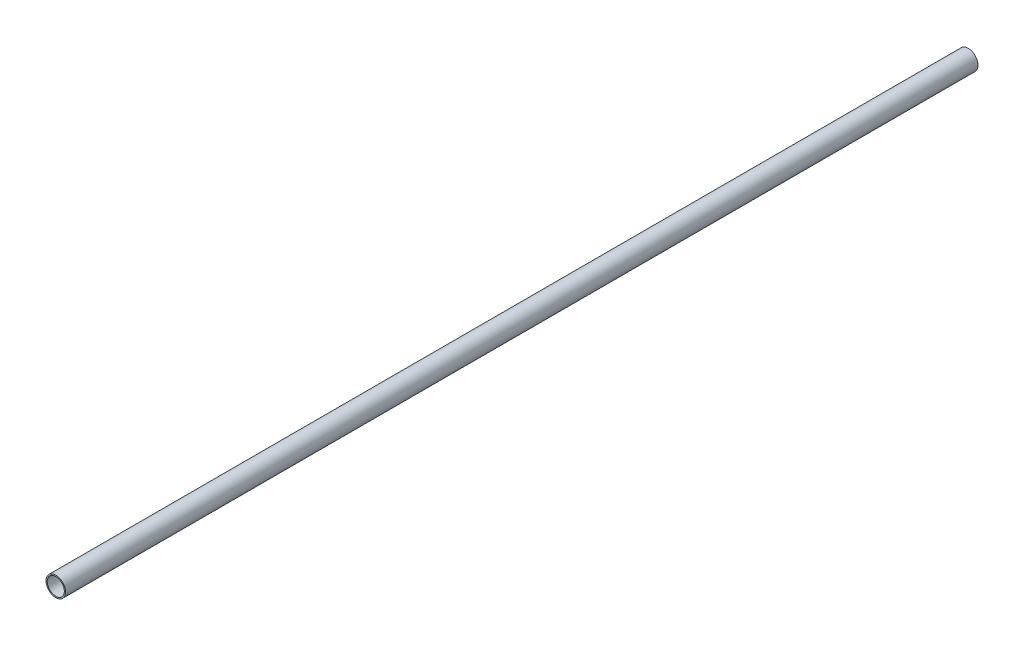
ISO-10303-21;
HEADER;
FILE_DESCRIPTION(('STEP AP214'),'2;1');
FILE_NAME('part.step','',(''),(''),'','','');
FILE_SCHEMA(('AUTOMOTIVE_DESIGN { 1 0 10303 214 1 1 1 1 }'));
ENDSEC;
DATA;
#1=APPLICATION_CONTEXT('core data for automotive mechanical design processes');
#2=APPLICATION_PROTOCOL_DEFINITION('international standard','automotive_design',2000,#1);
#3=PRODUCT_CONTEXT('',#1,'mechanical');
#4=PRODUCT('Part','Part','',(#3));
#5=PRODUCT_RELATED_PRODUCT_CATEGORY('part','',(#4));
#6=PRODUCT_DEFINITION_FORMATION('','',#4);
#7=PRODUCT_DEFINITION_CONTEXT('part definition',#1,'design');
#8=PRODUCT_DEFINITION('design','',#6,#7);
#9=PRODUCT_DEFINITION_SHAPE('','',#8);
#10=(LENGTH_UNIT() NAMED_UNIT(*) SI_UNIT(.MILLI.,.METRE.));
#11=(NAMED_UNIT(*) PLANE_ANGLE_UNIT() SI_UNIT($,.RADIAN.));
#12=(NAMED_UNIT(*) SI_UNIT($,.STERADIAN.) SOLID_ANGLE_UNIT());
#13=UNCERTAINTY_MEASURE_WITH_UNIT(LENGTH_MEASURE(1.E-05),#10,'distance_accuracy_value','');
#14=(GEOMETRIC_REPRESENTATION_CONTEXT(3) GLOBAL_UNCERTAINTY_ASSIGNED_CONTEXT((#13)) GLOBAL_UNIT_ASSIGNED_CONTEXT((#10,
#11,#12)) REPRESENTATION_CONTEXT('',''));
#15=CARTESIAN_POINT('',(0.,0.,0.));
#16=DIRECTION('',(0.,0.,1.));
#17=DIRECTION('',(1.,0.,0.));
#18=AXIS2_PLACEMENT_3D('',#15,#16,#17);
#19=CARTESIAN_POINT('',(2449.7201128805,-5187.00741573402,2250.));
#20=DIRECTION('',(0.,0.,1.));
#21=DIRECTION('',(1.,0.,0.));
#22=AXIS2_PLACEMENT_3D('',#19,#20,#21);
#23=PLANE('',#22);
#24=CARTESIAN_POINT('',(2449.7201128805,-5187.00741573402,2250.));
#25=DIRECTION('',(0.,0.,1.));
#26=DIRECTION('',(1.,0.,0.));
#27=AXIS2_PLACEMENT_3D('',#24,#25,#26);
#28=CIRCLE('',#27,24.125);
#29=CARTESIAN_POINT('',(2473.8451128805,-5187.00741573402,2250.));
#30=VERTEX_POINT('',#29);
#31=EDGE_CURVE('E10',#30,#30,#28,.T.);
#32=ORIENTED_EDGE('',*,*,#31,.T.);
#33=EDGE_LOOP('',(#32));
#34=FACE_BOUND('',#33,.T.);
#35=CARTESIAN_POINT('',(2449.7201128805,-5187.00741573402,2250.));
#36=DIRECTION('',(0.,0.,1.));
#37=DIRECTION('',(1.,0.,0.));
#38=AXIS2_PLACEMENT_3D('',#35,#36,#37);
#39=CIRCLE('',#38,21.0750000000002);
#40=CARTESIAN_POINT('',(2470.7951128805,-5187.00741573402,2250.));
#41=VERTEX_POINT('',#40);
#42=EDGE_CURVE('E43',#41,#41,#39,.T.);
#43=ORIENTED_EDGE('',*,*,#42,.F.);
#44=EDGE_LOOP('',(#43));
#45=FACE_BOUND('',#44,.T.);
#46=ADVANCED_FACE('F32',(#34,#45),#23,.T.);
#47=CARTESIAN_POINT('',(2449.7201128805,-5187.00741573402,0.));
#48=DIRECTION('',(0.,0.,1.));
#49=DIRECTION('',(1.,0.,0.));
#50=AXIS2_PLACEMENT_3D('',#47,#48,#49);
#51=PLANE('',#50);
#52=CARTESIAN_POINT('',(2449.7201128805,-5187.00741573402,0.));
#53=DIRECTION('',(0.,0.,1.));
#54=DIRECTION('',(1.,0.,0.));
#55=AXIS2_PLACEMENT_3D('',#52,#53,#54);
#56=CIRCLE('',#55,24.125);
#57=CARTESIAN_POINT('',(2473.8451128805,-5187.00741573402,0.));
#58=VERTEX_POINT('',#57);
#59=EDGE_CURVE('E36',#58,#58,#56,.T.);
#60=ORIENTED_EDGE('',*,*,#59,.F.);
#61=EDGE_LOOP('',(#60));
#62=FACE_BOUND('',#61,.T.);
#63=CARTESIAN_POINT('',(2449.7201128805,-5187.00741573402,0.));
#64=DIRECTION('',(0.,0.,1.));
#65=DIRECTION('',(1.,0.,0.));
#66=AXIS2_PLACEMENT_3D('',#63,#64,#65);
#67=CIRCLE('',#66,21.0750000000002);
#68=CARTESIAN_POINT('',(2470.7951128805,-5187.00741573402,0.));
#69=VERTEX_POINT('',#68);
#70=EDGE_CURVE('E45',#69,#69,#67,.T.);
#71=ORIENTED_EDGE('',*,*,#70,.T.);
#72=EDGE_LOOP('',(#71));
#73=FACE_BOUND('',#72,.T.);
#74=ADVANCED_FACE('F55',(#62,#73),#51,.F.);
#75=CARTESIAN_POINT('',(2449.7201128805,-5187.00741573402,2250.));
#76=DIRECTION('',(0.,0.,-1.));
#77=DIRECTION('',(-1.,0.,0.));
#78=AXIS2_PLACEMENT_3D('',#75,#76,#77);
#79=CYLINDRICAL_SURFACE('',#78,24.125);
#80=ORIENTED_EDGE('',*,*,#31,.F.);
#81=EDGE_LOOP('',(#80));
#82=FACE_BOUND('',#81,.T.);
#83=ORIENTED_EDGE('',*,*,#59,.T.);
#84=EDGE_LOOP('',(#83));
#85=FACE_BOUND('',#84,.T.);
#86=ADVANCED_FACE('F34',(#82,#85),#79,.T.);
#87=CARTESIAN_POINT('',(2449.7201128805,-5187.00741573402,2250.));
#88=DIRECTION('',(0.,0.,-1.));
#89=DIRECTION('',(-1.,0.,0.));
#90=AXIS2_PLACEMENT_3D('',#87,#88,#89);
#91=CYLINDRICAL_SURFACE('',#90,21.0750000000002);
#92=ORIENTED_EDGE('',*,*,#42,.T.);
#93=EDGE_LOOP('',(#92));
#94=FACE_BOUND('',#93,.T.);
#95=ORIENTED_EDGE('',*,*,#70,.F.);
#96=EDGE_LOOP('',(#95));
#97=FACE_BOUND('',#96,.T.);
#98=ADVANCED_FACE('F51',(#94,#97),#91,.F.);
#99=CLOSED_SHELL('',(#46,#74,#86,#98));
#100=MANIFOLD_SOLID_BREP('B2',#99);
#101=ADVANCED_BREP_SHAPE_REPRESENTATION('',(#18,#100),#14);
#102=SHAPE_DEFINITION_REPRESENTATION(#9,#101);
ENDSEC;
END-ISO-10303-21;
